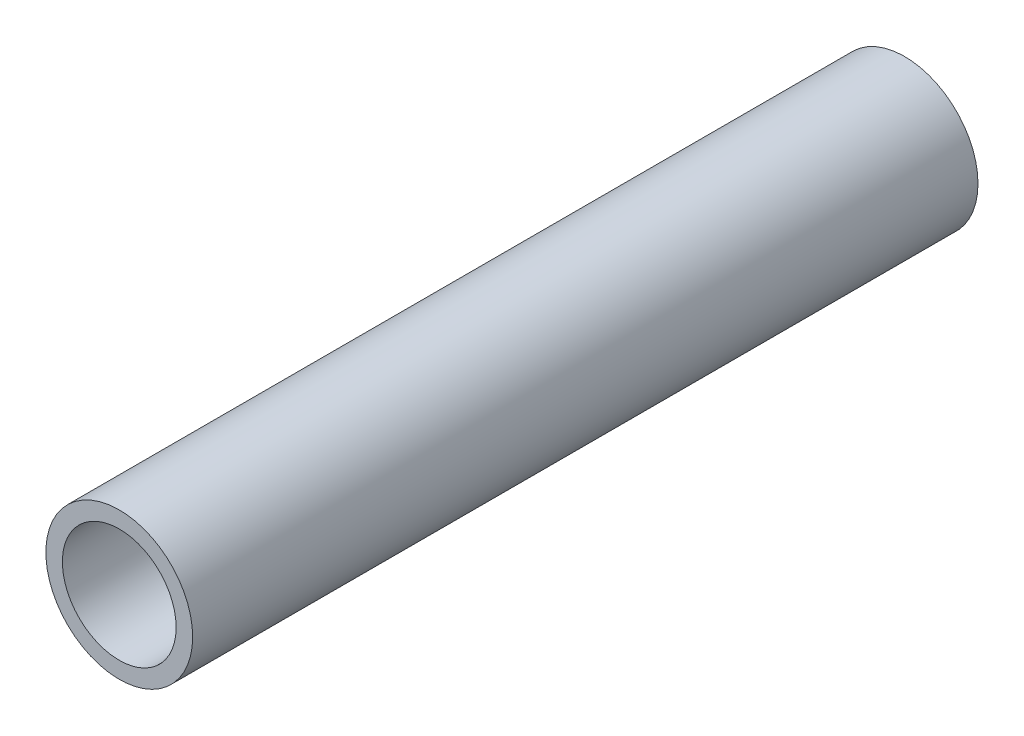
ISO-10303-21;
HEADER;
FILE_DESCRIPTION(('STEP AP214'),'2;1');
FILE_NAME('part.step','',(''),(''),'','','');
FILE_SCHEMA(('AUTOMOTIVE_DESIGN { 1 0 10303 214 1 1 1 1 }'));
ENDSEC;
DATA;
#1=APPLICATION_CONTEXT('core data for automotive mechanical design processes');
#2=APPLICATION_PROTOCOL_DEFINITION('international standard','automotive_design',2000,#1);
#3=PRODUCT_CONTEXT('',#1,'mechanical');
#4=PRODUCT('Part','Part','',(#3));
#5=PRODUCT_RELATED_PRODUCT_CATEGORY('part','',(#4));
#6=PRODUCT_DEFINITION_FORMATION('','',#4);
#7=PRODUCT_DEFINITION_CONTEXT('part definition',#1,'design');
#8=PRODUCT_DEFINITION('design','',#6,#7);
#9=PRODUCT_DEFINITION_SHAPE('','',#8);
#10=(LENGTH_UNIT() NAMED_UNIT(*) SI_UNIT(.MILLI.,.METRE.));
#11=(NAMED_UNIT(*) PLANE_ANGLE_UNIT() SI_UNIT($,.RADIAN.));
#12=(NAMED_UNIT(*) SI_UNIT($,.STERADIAN.) SOLID_ANGLE_UNIT());
#13=UNCERTAINTY_MEASURE_WITH_UNIT(LENGTH_MEASURE(1.E-05),#10,'distance_accuracy_value','');
#14=(GEOMETRIC_REPRESENTATION_CONTEXT(3) GLOBAL_UNCERTAINTY_ASSIGNED_CONTEXT((#13)) GLOBAL_UNIT_ASSIGNED_CONTEXT((#10,
#11,#12)) REPRESENTATION_CONTEXT('',''));
#15=CARTESIAN_POINT('',(0.,0.,0.));
#16=DIRECTION('',(0.,0.,1.));
#17=DIRECTION('',(1.,0.,0.));
#18=AXIS2_PLACEMENT_3D('',#15,#16,#17);
#19=CARTESIAN_POINT('',(0.,0.,10.7));
#20=DIRECTION('',(0.,0.,1.));
#21=DIRECTION('',(1.,0.,0.));
#22=AXIS2_PLACEMENT_3D('',#19,#20,#21);
#23=PLANE('',#22);
#24=CARTESIAN_POINT('',(0.,0.,10.7));
#25=DIRECTION('',(0.,0.,1.));
#26=DIRECTION('',(1.,0.,0.));
#27=AXIS2_PLACEMENT_3D('',#24,#25,#26);
#28=CIRCLE('',#27,1.);
#29=CARTESIAN_POINT('',(1.,0.,10.7));
#30=VERTEX_POINT('',#29);
#31=EDGE_CURVE('E10',#30,#30,#28,.T.);
#32=ORIENTED_EDGE('',*,*,#31,.T.);
#33=EDGE_LOOP('',(#32));
#34=FACE_BOUND('',#33,.T.);
#35=CARTESIAN_POINT('',(0.,0.,10.7));
#36=DIRECTION('',(0.,0.,1.));
#37=DIRECTION('',(1.,0.,0.));
#38=AXIS2_PLACEMENT_3D('',#35,#36,#37);
#39=CIRCLE('',#38,0.775);
#40=CARTESIAN_POINT('',(0.775,0.,10.7));
#41=VERTEX_POINT('',#40);
#42=EDGE_CURVE('E43',#41,#41,#39,.T.);
#43=ORIENTED_EDGE('',*,*,#42,.F.);
#44=EDGE_LOOP('',(#43));
#45=FACE_BOUND('',#44,.T.);
#46=ADVANCED_FACE('F32',(#34,#45),#23,.T.);
#47=CARTESIAN_POINT('',(0.,0.,0.));
#48=DIRECTION('',(0.,0.,1.));
#49=DIRECTION('',(1.,0.,0.));
#50=AXIS2_PLACEMENT_3D('',#47,#48,#49);
#51=PLANE('',#50);
#52=CARTESIAN_POINT('',(0.,0.,0.));
#53=DIRECTION('',(0.,0.,1.));
#54=DIRECTION('',(1.,0.,0.));
#55=AXIS2_PLACEMENT_3D('',#52,#53,#54);
#56=CIRCLE('',#55,1.);
#57=CARTESIAN_POINT('',(1.,0.,0.));
#58=VERTEX_POINT('',#57);
#59=EDGE_CURVE('E36',#58,#58,#56,.T.);
#60=ORIENTED_EDGE('',*,*,#59,.F.);
#61=EDGE_LOOP('',(#60));
#62=FACE_BOUND('',#61,.T.);
#63=CARTESIAN_POINT('',(0.,0.,0.));
#64=DIRECTION('',(0.,0.,1.));
#65=DIRECTION('',(1.,0.,0.));
#66=AXIS2_PLACEMENT_3D('',#63,#64,#65);
#67=CIRCLE('',#66,0.775);
#68=CARTESIAN_POINT('',(0.775,0.,0.));
#69=VERTEX_POINT('',#68);
#70=EDGE_CURVE('E45',#69,#69,#67,.T.);
#71=ORIENTED_EDGE('',*,*,#70,.T.);
#72=EDGE_LOOP('',(#71));
#73=FACE_BOUND('',#72,.T.);
#74=ADVANCED_FACE('F55',(#62,#73),#51,.F.);
#75=CARTESIAN_POINT('',(0.,0.,10.7));
#76=DIRECTION('',(0.,0.,-1.));
#77=DIRECTION('',(-1.,0.,0.));
#78=AXIS2_PLACEMENT_3D('',#75,#76,#77);
#79=CYLINDRICAL_SURFACE('',#78,1.);
#80=ORIENTED_EDGE('',*,*,#31,.F.);
#81=EDGE_LOOP('',(#80));
#82=FACE_BOUND('',#81,.T.);
#83=ORIENTED_EDGE('',*,*,#59,.T.);
#84=EDGE_LOOP('',(#83));
#85=FACE_BOUND('',#84,.T.);
#86=ADVANCED_FACE('F34',(#82,#85),#79,.T.);
#87=CARTESIAN_POINT('',(0.,0.,10.7));
#88=DIRECTION('',(0.,0.,-1.));
#89=DIRECTION('',(-1.,0.,0.));
#90=AXIS2_PLACEMENT_3D('',#87,#88,#89);
#91=CYLINDRICAL_SURFACE('',#90,0.775);
#92=ORIENTED_EDGE('',*,*,#42,.T.);
#93=EDGE_LOOP('',(#92));
#94=FACE_BOUND('',#93,.T.);
#95=ORIENTED_EDGE('',*,*,#70,.F.);
#96=EDGE_LOOP('',(#95));
#97=FACE_BOUND('',#96,.T.);
#98=ADVANCED_FACE('F51',(#94,#97),#91,.F.);
#99=CLOSED_SHELL('',(#46,#74,#86,#98));
#100=MANIFOLD_SOLID_BREP('B2',#99);
#101=ADVANCED_BREP_SHAPE_REPRESENTATION('',(#18,#100),#14);
#102=SHAPE_DEFINITION_REPRESENTATION(#9,#101);
ENDSEC;
END-ISO-10303-21;
